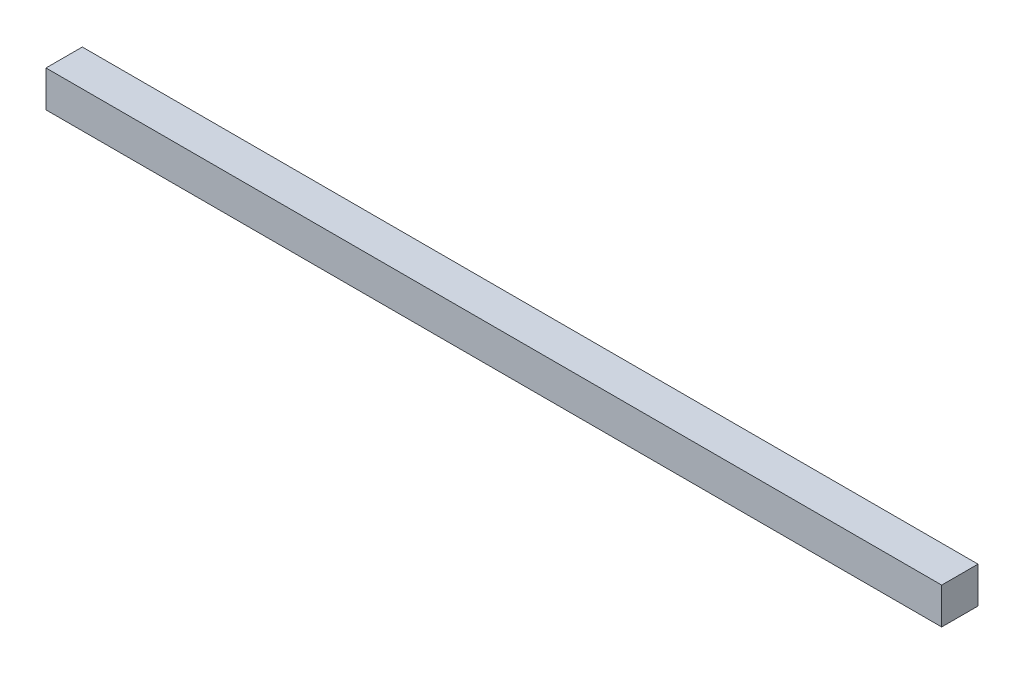
ISO-10303-21;
HEADER;
FILE_DESCRIPTION(('STEP AP214'),'2;1');
FILE_NAME('part.step','',(''),(''),'','','');
FILE_SCHEMA(('AUTOMOTIVE_DESIGN { 1 0 10303 214 1 1 1 1 }'));
ENDSEC;
DATA;
#1=APPLICATION_CONTEXT('core data for automotive mechanical design processes');
#2=APPLICATION_PROTOCOL_DEFINITION('international standard','automotive_design',2000,#1);
#3=PRODUCT_CONTEXT('',#1,'mechanical');
#4=PRODUCT('Part','Part','',(#3));
#5=PRODUCT_RELATED_PRODUCT_CATEGORY('part','',(#4));
#6=PRODUCT_DEFINITION_FORMATION('','',#4);
#7=PRODUCT_DEFINITION_CONTEXT('part definition',#1,'design');
#8=PRODUCT_DEFINITION('design','',#6,#7);
#9=PRODUCT_DEFINITION_SHAPE('','',#8);
#10=(LENGTH_UNIT() NAMED_UNIT(*) SI_UNIT(.MILLI.,.METRE.));
#11=(NAMED_UNIT(*) PLANE_ANGLE_UNIT() SI_UNIT($,.RADIAN.));
#12=(NAMED_UNIT(*) SI_UNIT($,.STERADIAN.) SOLID_ANGLE_UNIT());
#13=UNCERTAINTY_MEASURE_WITH_UNIT(LENGTH_MEASURE(1.E-05),#10,'distance_accuracy_value','');
#14=(GEOMETRIC_REPRESENTATION_CONTEXT(3) GLOBAL_UNCERTAINTY_ASSIGNED_CONTEXT((#13)) GLOBAL_UNIT_ASSIGNED_CONTEXT((#10,
#11,#12)) REPRESENTATION_CONTEXT('',''));
#15=CARTESIAN_POINT('',(0.,0.,0.));
#16=DIRECTION('',(0.,0.,1.));
#17=DIRECTION('',(1.,0.,0.));
#18=AXIS2_PLACEMENT_3D('',#15,#16,#17);
#19=CARTESIAN_POINT('',(185.,15.,-7.5));
#20=DIRECTION('',(-1.,0.,0.));
#21=DIRECTION('',(0.,0.,1.));
#22=AXIS2_PLACEMENT_3D('',#19,#20,#21);
#23=PLANE('',#22);
#24=DIRECTION('',(0.,0.,-1.));
#25=VECTOR('',#24,1.);
#26=CARTESIAN_POINT('',(185.,0.,-7.5));
#27=LINE('',#26,#25);
#28=CARTESIAN_POINT('',(185.,0.,7.5));
#29=VERTEX_POINT('',#28);
#30=CARTESIAN_POINT('',(185.,0.,-7.5));
#31=VERTEX_POINT('',#30);
#32=EDGE_CURVE('E95',#29,#31,#27,.T.);
#33=ORIENTED_EDGE('',*,*,#32,.T.);
#34=DIRECTION('',(0.,-1.,0.));
#35=VECTOR('',#34,1.);
#36=CARTESIAN_POINT('',(185.,15.,-7.5));
#37=LINE('',#36,#35);
#38=CARTESIAN_POINT('',(185.,15.,-7.5));
#39=VERTEX_POINT('',#38);
#40=EDGE_CURVE('E11',#39,#31,#37,.T.);
#41=ORIENTED_EDGE('',*,*,#40,.F.);
#42=DIRECTION('',(0.,0.,-1.));
#43=VECTOR('',#42,1.);
#44=CARTESIAN_POINT('',(185.,15.,-7.5));
#45=LINE('',#44,#43);
#46=CARTESIAN_POINT('',(185.,15.,7.5));
#47=VERTEX_POINT('',#46);
#48=EDGE_CURVE('E83',#47,#39,#45,.T.);
#49=ORIENTED_EDGE('',*,*,#48,.F.);
#50=DIRECTION('',(0.,-1.,0.));
#51=VECTOR('',#50,1.);
#52=CARTESIAN_POINT('',(185.,15.,7.5));
#53=LINE('',#52,#51);
#54=EDGE_CURVE('E91',#47,#29,#53,.T.);
#55=ORIENTED_EDGE('',*,*,#54,.T.);
#56=EDGE_LOOP('',(#33,#41,#49,#55));
#57=FACE_BOUND('',#56,.T.);
#58=ADVANCED_FACE('F32',(#57),#23,.F.);
#59=CARTESIAN_POINT('',(-185.,15.,-7.5));
#60=DIRECTION('',(0.,0.,1.));
#61=DIRECTION('',(1.,0.,0.));
#62=AXIS2_PLACEMENT_3D('',#59,#60,#61);
#63=PLANE('',#62);
#64=DIRECTION('',(-1.,0.,0.));
#65=VECTOR('',#64,1.);
#66=CARTESIAN_POINT('',(-185.,0.,-7.5));
#67=LINE('',#66,#65);
#68=CARTESIAN_POINT('',(-185.,0.,-7.5));
#69=VERTEX_POINT('',#68);
#70=EDGE_CURVE('E87',#31,#69,#67,.T.);
#71=ORIENTED_EDGE('',*,*,#70,.T.);
#72=DIRECTION('',(0.,-1.,0.));
#73=VECTOR('',#72,1.);
#74=CARTESIAN_POINT('',(-185.,15.,-7.5));
#75=LINE('',#74,#73);
#76=CARTESIAN_POINT('',(-185.,15.,-7.5));
#77=VERTEX_POINT('',#76);
#78=EDGE_CURVE('E40',#77,#69,#75,.T.);
#79=ORIENTED_EDGE('',*,*,#78,.F.);
#80=DIRECTION('',(-1.,0.,0.));
#81=VECTOR('',#80,1.);
#82=CARTESIAN_POINT('',(-185.,15.,-7.5));
#83=LINE('',#82,#81);
#84=EDGE_CURVE('E78',#39,#77,#83,.T.);
#85=ORIENTED_EDGE('',*,*,#84,.F.);
#86=ORIENTED_EDGE('',*,*,#40,.T.);
#87=EDGE_LOOP('',(#71,#79,#85,#86));
#88=FACE_BOUND('',#87,.T.);
#89=ADVANCED_FACE('F86',(#88),#63,.F.);
#90=CARTESIAN_POINT('',(-185.,15.,-7.5));
#91=DIRECTION('',(1.,0.,0.));
#92=DIRECTION('',(0.,0.,-1.));
#93=AXIS2_PLACEMENT_3D('',#90,#91,#92);
#94=PLANE('',#93);
#95=DIRECTION('',(0.,0.,1.));
#96=VECTOR('',#95,1.);
#97=CARTESIAN_POINT('',(-185.,0.,-7.5));
#98=LINE('',#97,#96);
#99=CARTESIAN_POINT('',(-185.,0.,7.5));
#100=VERTEX_POINT('',#99);
#101=EDGE_CURVE('E65',#69,#100,#98,.T.);
#102=ORIENTED_EDGE('',*,*,#101,.T.);
#103=DIRECTION('',(0.,-1.,0.));
#104=VECTOR('',#103,1.);
#105=CARTESIAN_POINT('',(-185.,15.,7.5));
#106=LINE('',#105,#104);
#107=CARTESIAN_POINT('',(-185.,15.,7.5));
#108=VERTEX_POINT('',#107);
#109=EDGE_CURVE('E88',#108,#100,#106,.T.);
#110=ORIENTED_EDGE('',*,*,#109,.F.);
#111=DIRECTION('',(0.,0.,1.));
#112=VECTOR('',#111,1.);
#113=CARTESIAN_POINT('',(-185.,15.,-7.5));
#114=LINE('',#113,#112);
#115=EDGE_CURVE('E81',#77,#108,#114,.T.);
#116=ORIENTED_EDGE('',*,*,#115,.F.);
#117=ORIENTED_EDGE('',*,*,#78,.T.);
#118=EDGE_LOOP('',(#102,#110,#116,#117));
#119=FACE_BOUND('',#118,.T.);
#120=ADVANCED_FACE('F89',(#119),#94,.F.);
#121=CARTESIAN_POINT('',(-185.,15.,7.5));
#122=DIRECTION('',(0.,0.,-1.));
#123=DIRECTION('',(-1.,0.,0.));
#124=AXIS2_PLACEMENT_3D('',#121,#122,#123);
#125=PLANE('',#124);
#126=DIRECTION('',(1.,0.,0.));
#127=VECTOR('',#126,1.);
#128=CARTESIAN_POINT('',(-185.,0.,7.5));
#129=LINE('',#128,#127);
#130=EDGE_CURVE('E71',#100,#29,#129,.T.);
#131=ORIENTED_EDGE('',*,*,#130,.T.);
#132=ORIENTED_EDGE('',*,*,#54,.F.);
#133=DIRECTION('',(1.,0.,0.));
#134=VECTOR('',#133,1.);
#135=CARTESIAN_POINT('',(-185.,15.,7.5));
#136=LINE('',#135,#134);
#137=EDGE_CURVE('E48',#108,#47,#136,.T.);
#138=ORIENTED_EDGE('',*,*,#137,.F.);
#139=ORIENTED_EDGE('',*,*,#109,.T.);
#140=EDGE_LOOP('',(#131,#132,#138,#139));
#141=FACE_BOUND('',#140,.T.);
#142=ADVANCED_FACE('F102',(#141),#125,.F.);
#143=CARTESIAN_POINT('',(0.,15.,0.));
#144=DIRECTION('',(0.,1.,0.));
#145=DIRECTION('',(0.,0.,1.));
#146=AXIS2_PLACEMENT_3D('',#143,#144,#145);
#147=PLANE('',#146);
#148=ORIENTED_EDGE('',*,*,#48,.T.);
#149=ORIENTED_EDGE('',*,*,#84,.T.);
#150=ORIENTED_EDGE('',*,*,#115,.T.);
#151=ORIENTED_EDGE('',*,*,#137,.T.);
#152=EDGE_LOOP('',(#148,#149,#150,#151));
#153=FACE_BOUND('',#152,.T.);
#154=ADVANCED_FACE('F79',(#153),#147,.T.);
#155=CARTESIAN_POINT('',(0.,0.,0.));
#156=DIRECTION('',(0.,1.,0.));
#157=DIRECTION('',(0.,0.,1.));
#158=AXIS2_PLACEMENT_3D('',#155,#156,#157);
#159=PLANE('',#158);
#160=ORIENTED_EDGE('',*,*,#32,.F.);
#161=ORIENTED_EDGE('',*,*,#130,.F.);
#162=ORIENTED_EDGE('',*,*,#101,.F.);
#163=ORIENTED_EDGE('',*,*,#70,.F.);
#164=EDGE_LOOP('',(#160,#161,#162,#163));
#165=FACE_BOUND('',#164,.T.);
#166=ADVANCED_FACE('F105',(#165),#159,.F.);
#167=CLOSED_SHELL('',(#58,#89,#120,#142,#154,#166));
#168=MANIFOLD_SOLID_BREP('B2',#167);
#169=ADVANCED_BREP_SHAPE_REPRESENTATION('',(#18,#168),#14);
#170=SHAPE_DEFINITION_REPRESENTATION(#9,#169);
ENDSEC;
END-ISO-10303-21;
